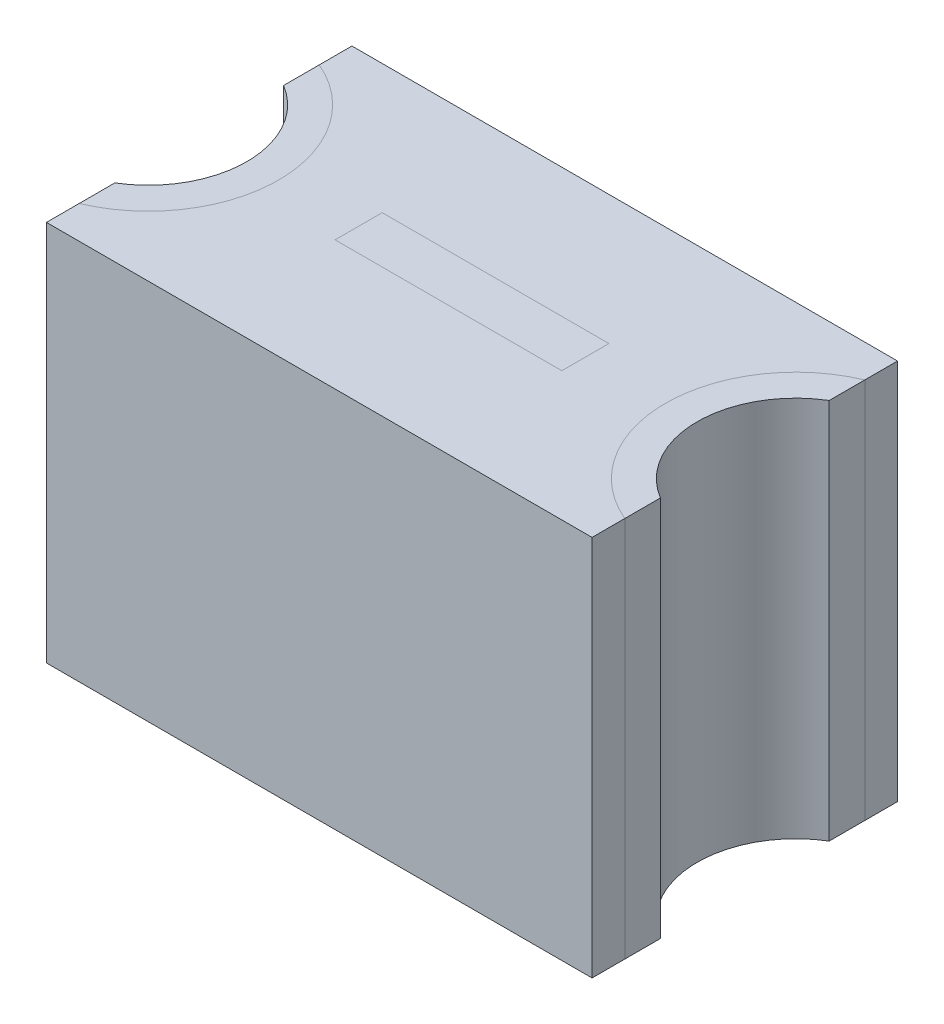
ISO-10303-21;
HEADER;
FILE_DESCRIPTION(('STEP AP214'),'2;1');
FILE_NAME('part.step','',(''),(''),'','','');
FILE_SCHEMA(('AUTOMOTIVE_DESIGN { 1 0 10303 214 1 1 1 1 }'));
ENDSEC;
DATA;
#1=APPLICATION_CONTEXT('core data for automotive mechanical design processes');
#2=APPLICATION_PROTOCOL_DEFINITION('international standard','automotive_design',2000,#1);
#3=PRODUCT_CONTEXT('',#1,'mechanical');
#4=PRODUCT('Part','Part','',(#3));
#5=PRODUCT_RELATED_PRODUCT_CATEGORY('part','',(#4));
#6=PRODUCT_DEFINITION_FORMATION('','',#4);
#7=PRODUCT_DEFINITION_CONTEXT('part definition',#1,'design');
#8=PRODUCT_DEFINITION('design','',#6,#7);
#9=PRODUCT_DEFINITION_SHAPE('','',#8);
#10=(LENGTH_UNIT() NAMED_UNIT(*) SI_UNIT(.MILLI.,.METRE.));
#11=(NAMED_UNIT(*) PLANE_ANGLE_UNIT() SI_UNIT($,.RADIAN.));
#12=(NAMED_UNIT(*) SI_UNIT($,.STERADIAN.) SOLID_ANGLE_UNIT());
#13=UNCERTAINTY_MEASURE_WITH_UNIT(LENGTH_MEASURE(1.E-05),#10,'distance_accuracy_value','');
#14=(GEOMETRIC_REPRESENTATION_CONTEXT(3) GLOBAL_UNCERTAINTY_ASSIGNED_CONTEXT((#13)) GLOBAL_UNIT_ASSIGNED_CONTEXT((#10,
#11,#12)) REPRESENTATION_CONTEXT('',''));
#15=CARTESIAN_POINT('',(0.,0.,0.));
#16=DIRECTION('',(0.,0.,1.));
#17=DIRECTION('',(1.,0.,0.));
#18=AXIS2_PLACEMENT_3D('',#15,#16,#17);
#19=CARTESIAN_POINT('',(4.646577910401,-1.995148951475,-4.551674841868));
#20=DIRECTION('',(0.,1.,0.));
#21=DIRECTION('',(0.,0.,1.));
#22=AXIS2_PLACEMENT_3D('',#19,#20,#21);
#23=CYLINDRICAL_SURFACE('',#22,0.310048429498);
#24=CARTESIAN_POINT('',(4.646577910401,-1.2,-4.551674841868));
#25=DIRECTION('',(0.,1.,0.));
#26=DIRECTION('',(0.,0.,1.));
#27=AXIS2_PLACEMENT_3D('',#24,#25,#26);
#28=CIRCLE('',#27,0.310048429498);
#29=CARTESIAN_POINT('',(4.486341377005,-1.2,-4.81710709687773));
#30=VERTEX_POINT('',#29);
#31=CARTESIAN_POINT('',(4.486341377005,-1.2,-4.28624258685827));
#32=VERTEX_POINT('',#31);
#33=EDGE_CURVE('P0_E20',#30,#32,#28,.T.);
#34=ORIENTED_EDGE('',*,*,#33,.F.);
#35=DIRECTION('',(0.,1.,0.));
#36=VECTOR('',#35,1.);
#37=CARTESIAN_POINT('',(4.486341377005,-1.995148951475,-4.817107096878));
#38=LINE('',#37,#36);
#39=CARTESIAN_POINT('',(4.486341377005,0.,-4.81710709687773));
#40=VERTEX_POINT('',#39);
#41=EDGE_CURVE('P0_E64',#40,#30,#38,.F.);
#42=ORIENTED_EDGE('',*,*,#41,.F.);
#43=CARTESIAN_POINT('',(4.646577910401,0.,-4.551674841868));
#44=DIRECTION('',(0.,1.,0.));
#45=DIRECTION('',(0.,0.,1.));
#46=AXIS2_PLACEMENT_3D('',#43,#44,#45);
#47=CIRCLE('',#46,0.310048429498);
#48=CARTESIAN_POINT('',(4.486341377005,0.,-4.28624258685827));
#49=VERTEX_POINT('',#48);
#50=EDGE_CURVE('P0_E67',#49,#40,#47,.F.);
#51=ORIENTED_EDGE('',*,*,#50,.F.);
#52=DIRECTION('',(0.,1.,0.));
#53=VECTOR('',#52,1.);
#54=CARTESIAN_POINT('',(4.486341377005,-1.995148951475,-4.286242586858));
#55=LINE('',#54,#53);
#56=EDGE_CURVE('P0_E65',#32,#49,#55,.T.);
#57=ORIENTED_EDGE('',*,*,#56,.F.);
#58=EDGE_LOOP('',(#34,#42,#51,#57));
#59=FACE_BOUND('',#58,.T.);
#60=ADVANCED_FACE('P0_F17',(#59),#23,.F.);
#61=CARTESIAN_POINT('',(4.486341377005,-1.995148951475,-4.929118834931));
#62=DIRECTION('',(1.,0.,0.));
#63=DIRECTION('',(0.,0.,-1.));
#64=AXIS2_PLACEMENT_3D('',#61,#62,#63);
#65=PLANE('',#64);
#66=DIRECTION('',(0.,1.,0.));
#67=VECTOR('',#66,1.);
#68=CARTESIAN_POINT('',(4.48634137700516,-1.995148951475,-4.92911883493063));
#69=LINE('',#68,#67);
#70=CARTESIAN_POINT('',(4.48634137700508,0.,-4.92911883493059));
#71=VERTEX_POINT('',#70);
#72=CARTESIAN_POINT('',(4.48634137700508,-1.2,-4.92911883493059));
#73=VERTEX_POINT('',#72);
#74=EDGE_CURVE('P0_E75',#71,#73,#69,.F.);
#75=ORIENTED_EDGE('',*,*,#74,.F.);
#76=DIRECTION('',(0.,0.,1.));
#77=VECTOR('',#76,1.);
#78=CARTESIAN_POINT('',(4.486341377005,0.,-4.551674841868));
#79=LINE('',#78,#77);
#80=EDGE_CURVE('P0_E80',#40,#71,#79,.F.);
#81=ORIENTED_EDGE('',*,*,#80,.F.);
#82=ORIENTED_EDGE('',*,*,#41,.T.);
#83=DIRECTION('',(0.,0.,-1.));
#84=VECTOR('',#83,1.);
#85=CARTESIAN_POINT('',(4.486341377005,-1.2,0.));
#86=LINE('',#85,#84);
#87=EDGE_CURVE('P0_E63',#73,#30,#86,.F.);
#88=ORIENTED_EDGE('',*,*,#87,.F.);
#89=EDGE_LOOP('',(#75,#81,#82,#88));
#90=FACE_BOUND('',#89,.T.);
#91=ADVANCED_FACE('P0_F90',(#90),#65,.T.);
#92=CARTESIAN_POINT('',(0.,-1.2,0.));
#93=DIRECTION('',(0.,-1.,0.));
#94=DIRECTION('',(0.,0.,-1.));
#95=AXIS2_PLACEMENT_3D('',#92,#93,#94);
#96=PLANE('',#95);
#97=CARTESIAN_POINT('',(4.646577910401,-1.2,-4.551674841868));
#98=DIRECTION('',(0.,1.,0.));
#99=DIRECTION('',(0.,0.,1.));
#100=AXIS2_PLACEMENT_3D('',#97,#98,#99);
#101=CIRCLE('',#100,0.410048429498);
#102=CARTESIAN_POINT('',(4.48634137700508,-1.2,-4.17423084880541));
#103=VERTEX_POINT('',#102);
#104=EDGE_CURVE('P0_E79',#73,#103,#101,.T.);
#105=ORIENTED_EDGE('',*,*,#104,.F.);
#106=ORIENTED_EDGE('',*,*,#87,.T.);
#107=ORIENTED_EDGE('',*,*,#33,.T.);
#108=DIRECTION('',(0.,0.,-1.));
#109=VECTOR('',#108,1.);
#110=CARTESIAN_POINT('',(4.486341377005,-1.2,-4.286242586858));
#111=LINE('',#110,#109);
#112=EDGE_CURVE('P0_E62',#103,#32,#111,.T.);
#113=ORIENTED_EDGE('',*,*,#112,.F.);
#114=EDGE_LOOP('',(#105,#106,#107,#113));
#115=FACE_BOUND('',#114,.T.);
#116=ADVANCED_FACE('P0_F60',(#115),#96,.T.);
#117=CARTESIAN_POINT('',(4.486341377005,-1.995148951475,-4.286242586858));
#118=DIRECTION('',(1.,0.,0.));
#119=DIRECTION('',(0.,0.,-1.));
#120=AXIS2_PLACEMENT_3D('',#117,#118,#119);
#121=PLANE('',#120);
#122=ORIENTED_EDGE('',*,*,#56,.T.);
#123=DIRECTION('',(0.,0.,1.));
#124=VECTOR('',#123,1.);
#125=CARTESIAN_POINT('',(4.486341377005,0.,-4.551674841868));
#126=LINE('',#125,#124);
#127=CARTESIAN_POINT('',(4.48634137700508,0.,-4.17423084880541));
#128=VERTEX_POINT('',#127);
#129=EDGE_CURVE('P0_E35',#128,#49,#126,.F.);
#130=ORIENTED_EDGE('',*,*,#129,.F.);
#131=DIRECTION('',(0.,1.,0.));
#132=VECTOR('',#131,1.);
#133=CARTESIAN_POINT('',(4.48634137700516,-1.995148951475,-4.17423084880537));
#134=LINE('',#133,#132);
#135=EDGE_CURVE('P0_E26',#103,#128,#134,.T.);
#136=ORIENTED_EDGE('',*,*,#135,.F.);
#137=ORIENTED_EDGE('',*,*,#112,.T.);
#138=EDGE_LOOP('',(#122,#130,#136,#137));
#139=FACE_BOUND('',#138,.T.);
#140=ADVANCED_FACE('P0_F69',(#139),#121,.T.);
#141=CARTESIAN_POINT('',(4.646577910401,0.,-4.551674841868));
#142=DIRECTION('',(0.,1.,0.));
#143=DIRECTION('',(0.,0.,1.));
#144=AXIS2_PLACEMENT_3D('',#141,#142,#143);
#145=PLANE('',#144);
#146=CARTESIAN_POINT('',(4.646577910401,0.,-4.551674841868));
#147=DIRECTION('',(0.,1.,0.));
#148=DIRECTION('',(0.,0.,1.));
#149=AXIS2_PLACEMENT_3D('',#146,#147,#148);
#150=CIRCLE('',#149,0.410048429498);
#151=EDGE_CURVE('P0_E11',#128,#71,#150,.F.);
#152=ORIENTED_EDGE('',*,*,#151,.F.);
#153=ORIENTED_EDGE('',*,*,#129,.T.);
#154=ORIENTED_EDGE('',*,*,#50,.T.);
#155=ORIENTED_EDGE('',*,*,#80,.T.);
#156=EDGE_LOOP('',(#152,#153,#154,#155));
#157=FACE_BOUND('',#156,.T.);
#158=ADVANCED_FACE('P0_F99',(#157),#145,.T.);
#159=CARTESIAN_POINT('',(4.646577910401,-1.995148951475,-4.551674841868));
#160=DIRECTION('',(0.,1.,0.));
#161=DIRECTION('',(0.,0.,1.));
#162=AXIS2_PLACEMENT_3D('',#159,#160,#161);
#163=CYLINDRICAL_SURFACE('',#162,0.410048429498);
#164=ORIENTED_EDGE('',*,*,#135,.T.);
#165=ORIENTED_EDGE('',*,*,#151,.T.);
#166=ORIENTED_EDGE('',*,*,#74,.T.);
#167=ORIENTED_EDGE('',*,*,#104,.T.);
#168=EDGE_LOOP('',(#164,#165,#166,#167));
#169=FACE_BOUND('',#168,.T.);
#170=ADVANCED_FACE('P0_F87',(#169),#163,.T.);
#171=CLOSED_SHELL('',(#60,#91,#116,#140,#158,#170));
#172=MANIFOLD_SOLID_BREP('P0_B1',#171);
#173=CARTESIAN_POINT('',(3.984916204577,-1.928180578813,-4.625703519728));
#174=DIRECTION('',(0.,0.,-1.));
#175=DIRECTION('',(-1.,0.,0.));
#176=AXIS2_PLACEMENT_3D('',#173,#174,#175);
#177=PLANE('',#176);
#178=DIRECTION('',(0.,1.,0.));
#179=VECTOR('',#178,1.);
#180=CARTESIAN_POINT('',(3.27194637718,-1.928180578813,-4.625703519728));
#181=LINE('',#180,#179);
#182=CARTESIAN_POINT('',(3.27194637718,0.,-4.625703519728));
#183=VERTEX_POINT('',#182);
#184=CARTESIAN_POINT('',(3.27194637718,-1.2,-4.625703519728));
#185=VERTEX_POINT('',#184);
#186=EDGE_CURVE('P1_E20',#183,#185,#181,.F.);
#187=ORIENTED_EDGE('',*,*,#186,.F.);
#188=DIRECTION('',(1.,0.,0.));
#189=VECTOR('',#188,1.);
#190=CARTESIAN_POINT('',(0.,0.,-4.625703519728));
#191=LINE('',#190,#189);
#192=CARTESIAN_POINT('',(3.984916204577,0.,-4.625703519728));
#193=VERTEX_POINT('',#192);
#194=EDGE_CURVE('P1_E81',#193,#183,#191,.F.);
#195=ORIENTED_EDGE('',*,*,#194,.F.);
#196=DIRECTION('',(0.,1.,0.));
#197=VECTOR('',#196,1.);
#198=CARTESIAN_POINT('',(3.984916204577,-1.928180578813,-4.625703519728));
#199=LINE('',#198,#197);
#200=CARTESIAN_POINT('',(3.984916204577,-1.2,-4.625703519728));
#201=VERTEX_POINT('',#200);
#202=EDGE_CURVE('P1_E68',#201,#193,#199,.T.);
#203=ORIENTED_EDGE('',*,*,#202,.F.);
#204=DIRECTION('',(1.,0.,0.));
#205=VECTOR('',#204,1.);
#206=CARTESIAN_POINT('',(0.,-1.2,-4.625703519728));
#207=LINE('',#206,#205);
#208=EDGE_CURVE('P1_E55',#185,#201,#207,.T.);
#209=ORIENTED_EDGE('',*,*,#208,.F.);
#210=EDGE_LOOP('',(#187,#195,#203,#209));
#211=FACE_BOUND('',#210,.T.);
#212=ADVANCED_FACE('P1_F17',(#211),#177,.T.);
#213=CARTESIAN_POINT('',(3.27194637718,-1.928180578813,-4.477646164007));
#214=DIRECTION('',(-1.,0.,0.));
#215=DIRECTION('',(0.,0.,1.));
#216=AXIS2_PLACEMENT_3D('',#213,#214,#215);
#217=PLANE('',#216);
#218=DIRECTION('',(0.,1.,0.));
#219=VECTOR('',#218,1.);
#220=CARTESIAN_POINT('',(3.27194637718,-1.928180578813,-4.477646164007));
#221=LINE('',#220,#219);
#222=CARTESIAN_POINT('',(3.27194637718,0.,-4.477646164007));
#223=VERTEX_POINT('',#222);
#224=CARTESIAN_POINT('',(3.27194637718,-1.2,-4.477646164007));
#225=VERTEX_POINT('',#224);
#226=EDGE_CURVE('P1_E83',#223,#225,#221,.F.);
#227=ORIENTED_EDGE('',*,*,#226,.F.);
#228=DIRECTION('',(0.,0.,1.));
#229=VECTOR('',#228,1.);
#230=CARTESIAN_POINT('',(3.27194637718,0.,0.));
#231=LINE('',#230,#229);
#232=EDGE_CURVE('P1_E64',#183,#223,#231,.T.);
#233=ORIENTED_EDGE('',*,*,#232,.F.);
#234=ORIENTED_EDGE('',*,*,#186,.T.);
#235=DIRECTION('',(0.,0.,-1.));
#236=VECTOR('',#235,1.);
#237=CARTESIAN_POINT('',(3.27194637718,-1.2,0.));
#238=LINE('',#237,#236);
#239=EDGE_CURVE('P1_E61',#225,#185,#238,.T.);
#240=ORIENTED_EDGE('',*,*,#239,.F.);
#241=EDGE_LOOP('',(#227,#233,#234,#240));
#242=FACE_BOUND('',#241,.T.);
#243=ADVANCED_FACE('P1_F60',(#242),#217,.T.);
#244=CARTESIAN_POINT('',(0.,-1.2,0.));
#245=DIRECTION('',(0.,-1.,0.));
#246=DIRECTION('',(0.,0.,-1.));
#247=AXIS2_PLACEMENT_3D('',#244,#245,#246);
#248=PLANE('',#247);
#249=DIRECTION('',(0.,0.,-1.));
#250=VECTOR('',#249,1.);
#251=CARTESIAN_POINT('',(3.984916204577,-1.2,-4.477646164007));
#252=LINE('',#251,#250);
#253=CARTESIAN_POINT('',(3.984916204577,-1.2,-4.477646164007));
#254=VERTEX_POINT('',#253);
#255=EDGE_CURVE('P1_E70',#254,#201,#252,.T.);
#256=ORIENTED_EDGE('',*,*,#255,.F.);
#257=DIRECTION('',(1.,0.,0.));
#258=VECTOR('',#257,1.);
#259=CARTESIAN_POINT('',(3.984916204577,-1.2,-4.477646164007));
#260=LINE('',#259,#258);
#261=EDGE_CURVE('P1_E74',#225,#254,#260,.T.);
#262=ORIENTED_EDGE('',*,*,#261,.F.);
#263=ORIENTED_EDGE('',*,*,#239,.T.);
#264=ORIENTED_EDGE('',*,*,#208,.T.);
#265=EDGE_LOOP('',(#256,#262,#263,#264));
#266=FACE_BOUND('',#265,.T.);
#267=ADVANCED_FACE('P1_F72',(#266),#248,.T.);
#268=CARTESIAN_POINT('',(3.984916204577,-1.928180578813,-4.477646164007));
#269=DIRECTION('',(1.,0.,0.));
#270=DIRECTION('',(0.,0.,-1.));
#271=AXIS2_PLACEMENT_3D('',#268,#269,#270);
#272=PLANE('',#271);
#273=ORIENTED_EDGE('',*,*,#202,.T.);
#274=DIRECTION('',(0.,0.,1.));
#275=VECTOR('',#274,1.);
#276=CARTESIAN_POINT('',(3.984916204577,0.,0.));
#277=LINE('',#276,#275);
#278=CARTESIAN_POINT('',(3.984916204577,0.,-4.477646164007));
#279=VERTEX_POINT('',#278);
#280=EDGE_CURVE('P1_E35',#279,#193,#277,.F.);
#281=ORIENTED_EDGE('',*,*,#280,.F.);
#282=DIRECTION('',(0.,1.,0.));
#283=VECTOR('',#282,1.);
#284=CARTESIAN_POINT('',(3.984916204577,-1.928180578813,-4.477646164007));
#285=LINE('',#284,#283);
#286=EDGE_CURVE('P1_E26',#254,#279,#285,.T.);
#287=ORIENTED_EDGE('',*,*,#286,.F.);
#288=ORIENTED_EDGE('',*,*,#255,.T.);
#289=EDGE_LOOP('',(#273,#281,#287,#288));
#290=FACE_BOUND('',#289,.T.);
#291=ADVANCED_FACE('P1_F89',(#290),#272,.T.);
#292=CARTESIAN_POINT('',(0.,0.,0.));
#293=DIRECTION('',(0.,1.,0.));
#294=DIRECTION('',(0.,0.,1.));
#295=AXIS2_PLACEMENT_3D('',#292,#293,#294);
#296=PLANE('',#295);
#297=ORIENTED_EDGE('',*,*,#280,.T.);
#298=ORIENTED_EDGE('',*,*,#194,.T.);
#299=ORIENTED_EDGE('',*,*,#232,.T.);
#300=DIRECTION('',(1.,0.,0.));
#301=VECTOR('',#300,1.);
#302=CARTESIAN_POINT('',(3.984916204577,0.,-4.477646164007));
#303=LINE('',#302,#301);
#304=EDGE_CURVE('P1_E11',#279,#223,#303,.F.);
#305=ORIENTED_EDGE('',*,*,#304,.F.);
#306=EDGE_LOOP('',(#297,#298,#299,#305));
#307=FACE_BOUND('',#306,.T.);
#308=ADVANCED_FACE('P1_F91',(#307),#296,.T.);
#309=CARTESIAN_POINT('',(3.984916204577,-1.928180578813,-4.477646164007));
#310=DIRECTION('',(0.,0.,1.));
#311=DIRECTION('',(1.,0.,0.));
#312=AXIS2_PLACEMENT_3D('',#309,#310,#311);
#313=PLANE('',#312);
#314=ORIENTED_EDGE('',*,*,#286,.T.);
#315=ORIENTED_EDGE('',*,*,#304,.T.);
#316=ORIENTED_EDGE('',*,*,#226,.T.);
#317=ORIENTED_EDGE('',*,*,#261,.T.);
#318=EDGE_LOOP('',(#314,#315,#316,#317));
#319=FACE_BOUND('',#318,.T.);
#320=ADVANCED_FACE('P1_F88',(#319),#313,.T.);
#321=CLOSED_SHELL('',(#212,#243,#267,#291,#308,#320));
#322=MANIFOLD_SOLID_BREP('P1_B1',#321);
#323=CARTESIAN_POINT('',(3.984916204577,-1.928180578813,-4.625703519728));
#324=DIRECTION('',(0.,0.,-1.));
#325=DIRECTION('',(-1.,0.,0.));
#326=AXIS2_PLACEMENT_3D('',#323,#324,#325);
#327=PLANE('',#326);
#328=DIRECTION('',(1.,0.,0.));
#329=VECTOR('',#328,1.);
#330=CARTESIAN_POINT('',(0.,0.,-4.625703519728));
#331=LINE('',#330,#329);
#332=CARTESIAN_POINT('',(3.984916204577,0.,-4.625703519728));
#333=VERTEX_POINT('',#332);
#334=CARTESIAN_POINT('',(3.27194637718,0.,-4.625703519728));
#335=VERTEX_POINT('',#334);
#336=EDGE_CURVE('P2_E167',#333,#335,#331,.F.);
#337=ORIENTED_EDGE('',*,*,#336,.T.);
#338=DIRECTION('',(0.,1.,0.));
#339=VECTOR('',#338,1.);
#340=CARTESIAN_POINT('',(3.27194637718,-1.928180578813,-4.625703519728));
#341=LINE('',#340,#339);
#342=CARTESIAN_POINT('',(3.27194637718,-1.2,-4.625703519728));
#343=VERTEX_POINT('',#342);
#344=EDGE_CURVE('P2_E176',#335,#343,#341,.F.);
#345=ORIENTED_EDGE('',*,*,#344,.T.);
#346=DIRECTION('',(1.,0.,0.));
#347=VECTOR('',#346,1.);
#348=CARTESIAN_POINT('',(0.,-1.2,-4.625703519728));
#349=LINE('',#348,#347);
#350=CARTESIAN_POINT('',(3.984916204577,-1.2,-4.625703519728));
#351=VERTEX_POINT('',#350);
#352=EDGE_CURVE('P2_E92',#351,#343,#349,.F.);
#353=ORIENTED_EDGE('',*,*,#352,.F.);
#354=DIRECTION('',(0.,1.,0.));
#355=VECTOR('',#354,1.);
#356=CARTESIAN_POINT('',(3.984916204577,-1.928180578813,-4.625703519728));
#357=LINE('',#356,#355);
#358=EDGE_CURVE('P2_E126',#351,#333,#357,.T.);
#359=ORIENTED_EDGE('',*,*,#358,.T.);
#360=EDGE_LOOP('',(#337,#345,#353,#359));
#361=FACE_BOUND('',#360,.T.);
#362=ADVANCED_FACE('P2_F17',(#361),#327,.F.);
#363=CARTESIAN_POINT('',(3.27194637718,-1.928180578813,-4.477646164007));
#364=DIRECTION('',(-1.,0.,0.));
#365=DIRECTION('',(0.,0.,1.));
#366=AXIS2_PLACEMENT_3D('',#363,#364,#365);
#367=PLANE('',#366);
#368=DIRECTION('',(0.,0.,-1.));
#369=VECTOR('',#368,1.);
#370=CARTESIAN_POINT('',(3.27194637718,0.,0.));
#371=LINE('',#370,#369);
#372=CARTESIAN_POINT('',(3.27194637718,0.,-4.477646164007));
#373=VERTEX_POINT('',#372);
#374=EDGE_CURVE('P2_E214',#335,#373,#371,.F.);
#375=ORIENTED_EDGE('',*,*,#374,.T.);
#376=DIRECTION('',(0.,1.,0.));
#377=VECTOR('',#376,1.);
#378=CARTESIAN_POINT('',(3.27194637718,-1.928180578813,-4.477646164007));
#379=LINE('',#378,#377);
#380=CARTESIAN_POINT('',(3.27194637718,-1.2,-4.477646164007));
#381=VERTEX_POINT('',#380);
#382=EDGE_CURVE('P2_E174',#373,#381,#379,.F.);
#383=ORIENTED_EDGE('',*,*,#382,.T.);
#384=DIRECTION('',(0.,0.,-1.));
#385=VECTOR('',#384,1.);
#386=CARTESIAN_POINT('',(3.27194637718,-1.2,0.));
#387=LINE('',#386,#385);
#388=EDGE_CURVE('P2_E111',#343,#381,#387,.F.);
#389=ORIENTED_EDGE('',*,*,#388,.F.);
#390=ORIENTED_EDGE('',*,*,#344,.F.);
#391=EDGE_LOOP('',(#375,#383,#389,#390));
#392=FACE_BOUND('',#391,.T.);
#393=ADVANCED_FACE('P2_F349',(#392),#367,.F.);
#394=CARTESIAN_POINT('',(3.984916204577,-1.928180578813,-4.477646164007));
#395=DIRECTION('',(0.,0.,1.));
#396=DIRECTION('',(1.,0.,0.));
#397=AXIS2_PLACEMENT_3D('',#394,#395,#396);
#398=PLANE('',#397);
#399=DIRECTION('',(1.,0.,0.));
#400=VECTOR('',#399,1.);
#401=CARTESIAN_POINT('',(0.,0.,-4.477646164007));
#402=LINE('',#401,#400);
#403=CARTESIAN_POINT('',(3.984916204577,0.,-4.477646164007));
#404=VERTEX_POINT('',#403);
#405=EDGE_CURVE('P2_E121',#373,#404,#402,.T.);
#406=ORIENTED_EDGE('',*,*,#405,.T.);
#407=DIRECTION('',(0.,1.,0.));
#408=VECTOR('',#407,1.);
#409=CARTESIAN_POINT('',(3.984916204577,-1.928180578813,-4.477646164007));
#410=LINE('',#409,#408);
#411=CARTESIAN_POINT('',(3.984916204577,-1.2,-4.477646164007));
#412=VERTEX_POINT('',#411);
#413=EDGE_CURVE('P2_E118',#404,#412,#410,.F.);
#414=ORIENTED_EDGE('',*,*,#413,.T.);
#415=DIRECTION('',(1.,0.,0.));
#416=VECTOR('',#415,1.);
#417=CARTESIAN_POINT('',(0.,-1.2,-4.477646164007));
#418=LINE('',#417,#416);
#419=EDGE_CURVE('P2_E105',#381,#412,#418,.T.);
#420=ORIENTED_EDGE('',*,*,#419,.F.);
#421=ORIENTED_EDGE('',*,*,#382,.F.);
#422=EDGE_LOOP('',(#406,#414,#420,#421));
#423=FACE_BOUND('',#422,.T.);
#424=ADVANCED_FACE('P2_F119',(#423),#398,.F.);
#425=CARTESIAN_POINT('',(3.984916204577,-1.928180578813,-4.477646164007));
#426=DIRECTION('',(1.,0.,0.));
#427=DIRECTION('',(0.,0.,-1.));
#428=AXIS2_PLACEMENT_3D('',#425,#426,#427);
#429=PLANE('',#428);
#430=DIRECTION('',(0.,0.,-1.));
#431=VECTOR('',#430,1.);
#432=CARTESIAN_POINT('',(3.984916204577,0.,0.));
#433=LINE('',#432,#431);
#434=EDGE_CURVE('P2_E218',#404,#333,#433,.T.);
#435=ORIENTED_EDGE('',*,*,#434,.T.);
#436=ORIENTED_EDGE('',*,*,#358,.F.);
#437=DIRECTION('',(0.,0.,-1.));
#438=VECTOR('',#437,1.);
#439=CARTESIAN_POINT('',(3.984916204577,-1.2,0.));
#440=LINE('',#439,#438);
#441=EDGE_CURVE('P2_E109',#412,#351,#440,.T.);
#442=ORIENTED_EDGE('',*,*,#441,.F.);
#443=ORIENTED_EDGE('',*,*,#413,.F.);
#444=EDGE_LOOP('',(#435,#436,#442,#443));
#445=FACE_BOUND('',#444,.T.);
#446=ADVANCED_FACE('P2_F128',(#445),#429,.F.);
#447=CARTESIAN_POINT('',(4.646577910401,0.,-4.551674841868));
#448=DIRECTION('',(0.,-1.,0.));
#449=DIRECTION('',(0.,0.,-1.));
#450=AXIS2_PLACEMENT_3D('',#447,#448,#449);
#451=CYLINDRICAL_SURFACE('',#450,0.410048429498);
#452=DIRECTION('',(0.,1.,0.));
#453=VECTOR('',#452,1.);
#454=CARTESIAN_POINT('',(4.486341377005,-1.2,-4.174230848805));
#455=LINE('',#454,#453);
#456=CARTESIAN_POINT('',(4.486341377005,0.,-4.17423084880522));
#457=VERTEX_POINT('',#456);
#458=CARTESIAN_POINT('',(4.486341377005,-1.2,-4.17423084880522));
#459=VERTEX_POINT('',#458);
#460=EDGE_CURVE('P2_E125',#457,#459,#455,.F.);
#461=ORIENTED_EDGE('',*,*,#460,.T.);
#462=CARTESIAN_POINT('',(4.646577910401,-1.2,-4.551674841868));
#463=DIRECTION('',(0.,-1.,0.));
#464=DIRECTION('',(0.,0.,-1.));
#465=AXIS2_PLACEMENT_3D('',#462,#463,#464);
#466=CIRCLE('',#465,0.410048429498);
#467=CARTESIAN_POINT('',(4.486341377005,-1.2,-4.92911883493078));
#468=VERTEX_POINT('',#467);
#469=EDGE_CURVE('P2_E197',#468,#459,#466,.F.);
#470=ORIENTED_EDGE('',*,*,#469,.F.);
#471=DIRECTION('',(0.,1.,0.));
#472=VECTOR('',#471,1.);
#473=CARTESIAN_POINT('',(4.486341377005,-1.2,-4.929118834931));
#474=LINE('',#473,#472);
#475=CARTESIAN_POINT('',(4.486341377005,0.,-4.92911883493078));
#476=VERTEX_POINT('',#475);
#477=EDGE_CURVE('P2_E165',#468,#476,#474,.T.);
#478=ORIENTED_EDGE('',*,*,#477,.T.);
#479=CARTESIAN_POINT('',(4.646577910401,0.,-4.551674841868));
#480=DIRECTION('',(0.,-1.,0.));
#481=DIRECTION('',(0.,0.,-1.));
#482=AXIS2_PLACEMENT_3D('',#479,#480,#481);
#483=CIRCLE('',#482,0.410048429498);
#484=EDGE_CURVE('P2_E195',#476,#457,#483,.F.);
#485=ORIENTED_EDGE('',*,*,#484,.T.);
#486=EDGE_LOOP('',(#461,#470,#478,#485));
#487=FACE_BOUND('',#486,.T.);
#488=ADVANCED_FACE('P2_F322',(#487),#451,.F.);
#489=CARTESIAN_POINT('',(4.486341377005,-1.2,-5.032015124465));
#490=DIRECTION('',(-1.,0.,0.));
#491=DIRECTION('',(0.,0.,1.));
#492=AXIS2_PLACEMENT_3D('',#489,#490,#491);
#493=PLANE('',#492);
#494=ORIENTED_EDGE('',*,*,#460,.F.);
#495=DIRECTION('',(0.,0.,-1.));
#496=VECTOR('',#495,1.);
#497=CARTESIAN_POINT('',(4.486341377005,0.,0.));
#498=LINE('',#497,#496);
#499=CARTESIAN_POINT('',(4.486341377005,0.,-4.071334559271));
#500=VERTEX_POINT('',#499);
#501=EDGE_CURVE('P2_E156',#457,#500,#498,.F.);
#502=ORIENTED_EDGE('',*,*,#501,.T.);
#503=DIRECTION('',(0.,1.,0.));
#504=VECTOR('',#503,1.);
#505=CARTESIAN_POINT('',(4.486341377005,-1.2,-4.071334559271));
#506=LINE('',#505,#504);
#507=CARTESIAN_POINT('',(4.486341377005,-1.2,-4.071334559271));
#508=VERTEX_POINT('',#507);
#509=EDGE_CURVE('P2_E149',#500,#508,#506,.F.);
#510=ORIENTED_EDGE('',*,*,#509,.T.);
#511=DIRECTION('',(0.,0.,-1.));
#512=VECTOR('',#511,1.);
#513=CARTESIAN_POINT('',(4.486341377005,-1.2,0.));
#514=LINE('',#513,#512);
#515=EDGE_CURVE('P2_E189',#459,#508,#514,.F.);
#516=ORIENTED_EDGE('',*,*,#515,.F.);
#517=EDGE_LOOP('',(#494,#502,#510,#516));
#518=FACE_BOUND('',#517,.T.);
#519=ADVANCED_FACE('P2_F312',(#518),#493,.F.);
#520=CARTESIAN_POINT('',(4.486341377005,-1.2,-4.071334559271));
#521=DIRECTION('',(0.,0.,-1.));
#522=DIRECTION('',(-1.,0.,0.));
#523=AXIS2_PLACEMENT_3D('',#520,#521,#522);
#524=PLANE('',#523);
#525=DIRECTION('',(0.,1.,0.));
#526=VECTOR('',#525,1.);
#527=CARTESIAN_POINT('',(2.770521204752,-1.2,-4.071334559271));
#528=LINE('',#527,#526);
#529=CARTESIAN_POINT('',(2.770521204752,0.,-4.071334559271));
#530=VERTEX_POINT('',#529);
#531=CARTESIAN_POINT('',(2.770521204752,-1.2,-4.071334559271));
#532=VERTEX_POINT('',#531);
#533=EDGE_CURVE('P2_E146',#530,#532,#528,.F.);
#534=ORIENTED_EDGE('',*,*,#533,.T.);
#535=DIRECTION('',(1.,0.,0.));
#536=VECTOR('',#535,1.);
#537=CARTESIAN_POINT('',(0.,-1.2,-4.071334559271));
#538=LINE('',#537,#536);
#539=EDGE_CURVE('P2_E187',#508,#532,#538,.F.);
#540=ORIENTED_EDGE('',*,*,#539,.F.);
#541=ORIENTED_EDGE('',*,*,#509,.F.);
#542=DIRECTION('',(1.,0.,0.));
#543=VECTOR('',#542,1.);
#544=CARTESIAN_POINT('',(0.,0.,-4.071334559271));
#545=LINE('',#544,#543);
#546=EDGE_CURVE('P2_E152',#500,#530,#545,.F.);
#547=ORIENTED_EDGE('',*,*,#546,.T.);
#548=EDGE_LOOP('',(#534,#540,#541,#547));
#549=FACE_BOUND('',#548,.T.);
#550=ADVANCED_FACE('P2_F303',(#549),#524,.F.);
#551=CARTESIAN_POINT('',(2.770521204752,-1.2,-5.032015124465));
#552=DIRECTION('',(1.,0.,0.));
#553=DIRECTION('',(0.,0.,-1.));
#554=AXIS2_PLACEMENT_3D('',#551,#552,#553);
#555=PLANE('',#554);
#556=DIRECTION('',(0.,-1.,0.));
#557=VECTOR('',#556,1.);
#558=CARTESIAN_POINT('',(2.77052120475184,0.,-4.17423084880537));
#559=LINE('',#558,#557);
#560=CARTESIAN_POINT('',(2.77052120475192,0.,-4.17423084880541));
#561=VERTEX_POINT('',#560);
#562=CARTESIAN_POINT('',(2.77052120475192,-1.2,-4.17423084880541));
#563=VERTEX_POINT('',#562);
#564=EDGE_CURVE('P2_E82',#561,#563,#559,.T.);
#565=ORIENTED_EDGE('',*,*,#564,.T.);
#566=DIRECTION('',(0.,0.,-1.));
#567=VECTOR('',#566,1.);
#568=CARTESIAN_POINT('',(2.770521204752,-1.2,0.));
#569=LINE('',#568,#567);
#570=EDGE_CURVE('P2_E180',#532,#563,#569,.T.);
#571=ORIENTED_EDGE('',*,*,#570,.F.);
#572=ORIENTED_EDGE('',*,*,#533,.F.);
#573=DIRECTION('',(0.,0.,-1.));
#574=VECTOR('',#573,1.);
#575=CARTESIAN_POINT('',(2.770521204752,0.,0.));
#576=LINE('',#575,#574);
#577=EDGE_CURVE('P2_E155',#530,#561,#576,.T.);
#578=ORIENTED_EDGE('',*,*,#577,.T.);
#579=EDGE_LOOP('',(#565,#571,#572,#578));
#580=FACE_BOUND('',#579,.T.);
#581=ADVANCED_FACE('P2_F293',(#580),#555,.F.);
#582=CARTESIAN_POINT('',(2.610284671356,0.,-4.551674841868));
#583=DIRECTION('',(0.,-1.,0.));
#584=DIRECTION('',(0.,0.,-1.));
#585=AXIS2_PLACEMENT_3D('',#582,#583,#584);
#586=CYLINDRICAL_SURFACE('',#585,0.410048429498);
#587=DIRECTION('',(0.,1.,0.));
#588=VECTOR('',#587,1.);
#589=CARTESIAN_POINT('',(2.770521204752,-1.2,-4.929118834931));
#590=LINE('',#589,#588);
#591=CARTESIAN_POINT('',(2.770521204752,0.,-4.92911883493078));
#592=VERTEX_POINT('',#591);
#593=CARTESIAN_POINT('',(2.770521204752,-1.2,-4.92911883493078));
#594=VERTEX_POINT('',#593);
#595=EDGE_CURVE('P2_E114',#592,#594,#590,.F.);
#596=ORIENTED_EDGE('',*,*,#595,.T.);
#597=CARTESIAN_POINT('',(2.610284671356,-1.2,-4.551674841868));
#598=DIRECTION('',(0.,-1.,0.));
#599=DIRECTION('',(0.,0.,-1.));
#600=AXIS2_PLACEMENT_3D('',#597,#598,#599);
#601=CIRCLE('',#600,0.410048429498);
#602=EDGE_CURVE('P2_E20',#563,#594,#601,.F.);
#603=ORIENTED_EDGE('',*,*,#602,.F.);
#604=ORIENTED_EDGE('',*,*,#564,.F.);
#605=CARTESIAN_POINT('',(2.610284671356,0.,-4.551674841868));
#606=DIRECTION('',(0.,-1.,0.));
#607=DIRECTION('',(0.,0.,-1.));
#608=AXIS2_PLACEMENT_3D('',#605,#606,#607);
#609=CIRCLE('',#608,0.410048429498);
#610=EDGE_CURVE('P2_E192',#561,#592,#609,.F.);
#611=ORIENTED_EDGE('',*,*,#610,.T.);
#612=EDGE_LOOP('',(#596,#603,#604,#611));
#613=FACE_BOUND('',#612,.T.);
#614=ADVANCED_FACE('P2_F255',(#613),#586,.F.);
#615=CARTESIAN_POINT('',(2.770521204752,-1.2,-5.032015124465));
#616=DIRECTION('',(1.,0.,0.));
#617=DIRECTION('',(0.,0.,-1.));
#618=AXIS2_PLACEMENT_3D('',#615,#616,#617);
#619=PLANE('',#618);
#620=ORIENTED_EDGE('',*,*,#595,.F.);
#621=DIRECTION('',(0.,0.,-1.));
#622=VECTOR('',#621,1.);
#623=CARTESIAN_POINT('',(2.770521204752,0.,0.));
#624=LINE('',#623,#622);
#625=CARTESIAN_POINT('',(2.770521204752,0.,-5.032015124465));
#626=VERTEX_POINT('',#625);
#627=EDGE_CURVE('P2_E140',#592,#626,#624,.T.);
#628=ORIENTED_EDGE('',*,*,#627,.T.);
#629=DIRECTION('',(0.,1.,0.));
#630=VECTOR('',#629,1.);
#631=CARTESIAN_POINT('',(2.770521204752,-1.2,-5.032015124465));
#632=LINE('',#631,#630);
#633=CARTESIAN_POINT('',(2.770521204752,-1.2,-5.032015124465));
#634=VERTEX_POINT('',#633);
#635=EDGE_CURVE('P2_E136',#626,#634,#632,.F.);
#636=ORIENTED_EDGE('',*,*,#635,.T.);
#637=DIRECTION('',(0.,0.,-1.));
#638=VECTOR('',#637,1.);
#639=CARTESIAN_POINT('',(2.770521204752,-1.2,0.));
#640=LINE('',#639,#638);
#641=EDGE_CURVE('P2_E198',#594,#634,#640,.T.);
#642=ORIENTED_EDGE('',*,*,#641,.F.);
#643=EDGE_LOOP('',(#620,#628,#636,#642));
#644=FACE_BOUND('',#643,.T.);
#645=ADVANCED_FACE('P2_F235',(#644),#619,.F.);
#646=CARTESIAN_POINT('',(0.,-1.2,0.));
#647=DIRECTION('',(0.,-1.,0.));
#648=DIRECTION('',(0.,0.,-1.));
#649=AXIS2_PLACEMENT_3D('',#646,#647,#648);
#650=PLANE('',#649);
#651=ORIENTED_EDGE('',*,*,#539,.T.);
#652=ORIENTED_EDGE('',*,*,#570,.T.);
#653=ORIENTED_EDGE('',*,*,#602,.T.);
#654=ORIENTED_EDGE('',*,*,#641,.T.);
#655=DIRECTION('',(1.,0.,0.));
#656=VECTOR('',#655,1.);
#657=CARTESIAN_POINT('',(4.486341377005,-1.2,-5.032015124465));
#658=LINE('',#657,#656);
#659=CARTESIAN_POINT('',(4.486341377005,-1.2,-5.032015124465));
#660=VERTEX_POINT('',#659);
#661=EDGE_CURVE('P2_E139',#634,#660,#658,.T.);
#662=ORIENTED_EDGE('',*,*,#661,.T.);
#663=DIRECTION('',(0.,0.,1.));
#664=VECTOR('',#663,1.);
#665=CARTESIAN_POINT('',(4.486341377005,-1.2,-5.032015124465));
#666=LINE('',#665,#664);
#667=EDGE_CURVE('P2_E168',#660,#468,#666,.T.);
#668=ORIENTED_EDGE('',*,*,#667,.T.);
#669=ORIENTED_EDGE('',*,*,#469,.T.);
#670=ORIENTED_EDGE('',*,*,#515,.T.);
#671=EDGE_LOOP('',(#651,#652,#653,#654,#662,#668,#669,#670));
#672=FACE_BOUND('',#671,.T.);
#673=ORIENTED_EDGE('',*,*,#352,.T.);
#674=ORIENTED_EDGE('',*,*,#388,.T.);
#675=ORIENTED_EDGE('',*,*,#419,.T.);
#676=ORIENTED_EDGE('',*,*,#441,.T.);
#677=EDGE_LOOP('',(#673,#674,#675,#676));
#678=FACE_BOUND('',#677,.T.);
#679=ADVANCED_FACE('P2_F107',(#672,#678),#650,.T.);
#680=CARTESIAN_POINT('',(4.486341377005,-1.2,-5.032015124465));
#681=DIRECTION('',(-1.,0.,0.));
#682=DIRECTION('',(0.,0.,1.));
#683=AXIS2_PLACEMENT_3D('',#680,#681,#682);
#684=PLANE('',#683);
#685=ORIENTED_EDGE('',*,*,#477,.F.);
#686=ORIENTED_EDGE('',*,*,#667,.F.);
#687=DIRECTION('',(0.,1.,0.));
#688=VECTOR('',#687,1.);
#689=CARTESIAN_POINT('',(4.486341377005,-1.2,-5.032015124465));
#690=LINE('',#689,#688);
#691=CARTESIAN_POINT('',(4.486341377005,0.,-5.032015124465));
#692=VERTEX_POINT('',#691);
#693=EDGE_CURVE('P2_E26',#660,#692,#690,.T.);
#694=ORIENTED_EDGE('',*,*,#693,.T.);
#695=DIRECTION('',(0.,0.,-1.));
#696=VECTOR('',#695,1.);
#697=CARTESIAN_POINT('',(4.486341377005,0.,0.));
#698=LINE('',#697,#696);
#699=EDGE_CURVE('P2_E34',#692,#476,#698,.F.);
#700=ORIENTED_EDGE('',*,*,#699,.T.);
#701=EDGE_LOOP('',(#685,#686,#694,#700));
#702=FACE_BOUND('',#701,.T.);
#703=ADVANCED_FACE('P2_F245',(#702),#684,.F.);
#704=CARTESIAN_POINT('',(0.,0.,0.));
#705=DIRECTION('',(0.,-1.,0.));
#706=DIRECTION('',(0.,0.,-1.));
#707=AXIS2_PLACEMENT_3D('',#704,#705,#706);
#708=PLANE('',#707);
#709=ORIENTED_EDGE('',*,*,#610,.F.);
#710=ORIENTED_EDGE('',*,*,#577,.F.);
#711=ORIENTED_EDGE('',*,*,#546,.F.);
#712=ORIENTED_EDGE('',*,*,#501,.F.);
#713=ORIENTED_EDGE('',*,*,#484,.F.);
#714=ORIENTED_EDGE('',*,*,#699,.F.);
#715=DIRECTION('',(1.,0.,0.));
#716=VECTOR('',#715,1.);
#717=CARTESIAN_POINT('',(4.486341377005,0.,-5.032015124465));
#718=LINE('',#717,#716);
#719=EDGE_CURVE('P2_E11',#692,#626,#718,.F.);
#720=ORIENTED_EDGE('',*,*,#719,.T.);
#721=ORIENTED_EDGE('',*,*,#627,.F.);
#722=EDGE_LOOP('',(#709,#710,#711,#712,#713,#714,#720,#721));
#723=FACE_BOUND('',#722,.T.);
#724=ORIENTED_EDGE('',*,*,#405,.F.);
#725=ORIENTED_EDGE('',*,*,#374,.F.);
#726=ORIENTED_EDGE('',*,*,#336,.F.);
#727=ORIENTED_EDGE('',*,*,#434,.F.);
#728=EDGE_LOOP('',(#724,#725,#726,#727));
#729=FACE_BOUND('',#728,.T.);
#730=ADVANCED_FACE('P2_F238',(#723,#729),#708,.F.);
#731=CARTESIAN_POINT('',(4.486341377005,-1.2,-5.032015124465));
#732=DIRECTION('',(0.,0.,1.));
#733=DIRECTION('',(1.,0.,0.));
#734=AXIS2_PLACEMENT_3D('',#731,#732,#733);
#735=PLANE('',#734);
#736=ORIENTED_EDGE('',*,*,#693,.F.);
#737=ORIENTED_EDGE('',*,*,#661,.F.);
#738=ORIENTED_EDGE('',*,*,#635,.F.);
#739=ORIENTED_EDGE('',*,*,#719,.F.);
#740=EDGE_LOOP('',(#736,#737,#738,#739));
#741=FACE_BOUND('',#740,.T.);
#742=ADVANCED_FACE('P2_F242',(#741),#735,.F.);
#743=CLOSED_SHELL('',(#362,#393,#424,#446,#488,#519,#550,#581,#614,#645,#679,#703,#730,#742));
#744=MANIFOLD_SOLID_BREP('P2_B1',#743);
#745=CARTESIAN_POINT('',(2.610284671356,-1.995148951475,-4.551674841868));
#746=DIRECTION('',(0.,1.,0.));
#747=DIRECTION('',(0.,0.,1.));
#748=AXIS2_PLACEMENT_3D('',#745,#746,#747);
#749=CYLINDRICAL_SURFACE('',#748,0.310048429498);
#750=CARTESIAN_POINT('',(2.610284671356,-1.2,-4.551674841868));
#751=DIRECTION('',(0.,1.,0.));
#752=DIRECTION('',(0.,0.,1.));
#753=AXIS2_PLACEMENT_3D('',#750,#751,#752);
#754=CIRCLE('',#753,0.310048429498);
#755=CARTESIAN_POINT('',(2.770521204752,-1.2,-4.28624258685827));
#756=VERTEX_POINT('',#755);
#757=CARTESIAN_POINT('',(2.770521204752,-1.2,-4.81710709687773));
#758=VERTEX_POINT('',#757);
#759=EDGE_CURVE('P3_E20',#756,#758,#754,.T.);
#760=ORIENTED_EDGE('',*,*,#759,.F.);
#761=DIRECTION('',(0.,1.,0.));
#762=VECTOR('',#761,1.);
#763=CARTESIAN_POINT('',(2.770521204752,-1.995148951475,-4.286242586858));
#764=LINE('',#763,#762);
#765=CARTESIAN_POINT('',(2.770521204752,0.,-4.28624258685827));
#766=VERTEX_POINT('',#765);
#767=EDGE_CURVE('P3_E55',#766,#756,#764,.F.);
#768=ORIENTED_EDGE('',*,*,#767,.F.);
#769=CARTESIAN_POINT('',(2.610284671356,0.,-4.551674841868));
#770=DIRECTION('',(0.,1.,0.));
#771=DIRECTION('',(0.,0.,1.));
#772=AXIS2_PLACEMENT_3D('',#769,#770,#771);
#773=CIRCLE('',#772,0.310048429498);
#774=CARTESIAN_POINT('',(2.770521204752,0.,-4.81710709687773));
#775=VERTEX_POINT('',#774);
#776=EDGE_CURVE('P3_E69',#766,#775,#773,.T.);
#777=ORIENTED_EDGE('',*,*,#776,.T.);
#778=DIRECTION('',(0.,1.,0.));
#779=VECTOR('',#778,1.);
#780=CARTESIAN_POINT('',(2.770521204752,-1.995148951475,-4.817107096878));
#781=LINE('',#780,#779);
#782=EDGE_CURVE('P3_E67',#758,#775,#781,.T.);
#783=ORIENTED_EDGE('',*,*,#782,.F.);
#784=EDGE_LOOP('',(#760,#768,#777,#783));
#785=FACE_BOUND('',#784,.T.);
#786=ADVANCED_FACE('P3_F17',(#785),#749,.F.);
#787=CARTESIAN_POINT('',(2.770521204752,-1.995148951475,-4.286242586858));
#788=DIRECTION('',(-1.,0.,0.));
#789=DIRECTION('',(0.,0.,1.));
#790=AXIS2_PLACEMENT_3D('',#787,#788,#789);
#791=PLANE('',#790);
#792=DIRECTION('',(0.,1.,0.));
#793=VECTOR('',#792,1.);
#794=CARTESIAN_POINT('',(2.77052120475184,-1.995148951475,-4.17423084880537));
#795=LINE('',#794,#793);
#796=CARTESIAN_POINT('',(2.77052120475192,0.,-4.17423084880541));
#797=VERTEX_POINT('',#796);
#798=CARTESIAN_POINT('',(2.77052120475192,-1.2,-4.17423084880541));
#799=VERTEX_POINT('',#798);
#800=EDGE_CURVE('P3_E78',#797,#799,#795,.F.);
#801=ORIENTED_EDGE('',*,*,#800,.F.);
#802=DIRECTION('',(0.,0.,-1.));
#803=VECTOR('',#802,1.);
#804=CARTESIAN_POINT('',(2.770521204752,0.,-4.551674841868));
#805=LINE('',#804,#803);
#806=EDGE_CURVE('P3_E70',#797,#766,#805,.T.);
#807=ORIENTED_EDGE('',*,*,#806,.T.);
#808=ORIENTED_EDGE('',*,*,#767,.T.);
#809=DIRECTION('',(0.,0.,-1.));
#810=VECTOR('',#809,1.);
#811=CARTESIAN_POINT('',(2.770521204752,-1.2,0.));
#812=LINE('',#811,#810);
#813=EDGE_CURVE('P3_E65',#799,#756,#812,.T.);
#814=ORIENTED_EDGE('',*,*,#813,.F.);
#815=EDGE_LOOP('',(#801,#807,#808,#814));
#816=FACE_BOUND('',#815,.T.);
#817=ADVANCED_FACE('P3_F89',(#816),#791,.T.);
#818=CARTESIAN_POINT('',(0.,-1.2,0.));
#819=DIRECTION('',(0.,-1.,0.));
#820=DIRECTION('',(0.,0.,-1.));
#821=AXIS2_PLACEMENT_3D('',#818,#819,#820);
#822=PLANE('',#821);
#823=ORIENTED_EDGE('',*,*,#759,.T.);
#824=DIRECTION('',(0.,0.,1.));
#825=VECTOR('',#824,1.);
#826=CARTESIAN_POINT('',(2.770521204752,-1.2,-4.929118834931));
#827=LINE('',#826,#825);
#828=CARTESIAN_POINT('',(2.77052120475192,-1.2,-4.92911883493059));
#829=VERTEX_POINT('',#828);
#830=EDGE_CURVE('P3_E64',#829,#758,#827,.T.);
#831=ORIENTED_EDGE('',*,*,#830,.F.);
#832=CARTESIAN_POINT('',(2.610284671356,-1.2,-4.551674841868));
#833=DIRECTION('',(0.,1.,0.));
#834=DIRECTION('',(0.,0.,1.));
#835=AXIS2_PLACEMENT_3D('',#832,#833,#834);
#836=CIRCLE('',#835,0.410048429498);
#837=EDGE_CURVE('P3_E82',#799,#829,#836,.T.);
#838=ORIENTED_EDGE('',*,*,#837,.F.);
#839=ORIENTED_EDGE('',*,*,#813,.T.);
#840=EDGE_LOOP('',(#823,#831,#838,#839));
#841=FACE_BOUND('',#840,.T.);
#842=ADVANCED_FACE('P3_F61',(#841),#822,.T.);
#843=CARTESIAN_POINT('',(2.770521204752,-1.995148951475,-4.929118834931));
#844=DIRECTION('',(-1.,0.,0.));
#845=DIRECTION('',(0.,0.,1.));
#846=AXIS2_PLACEMENT_3D('',#843,#844,#845);
#847=PLANE('',#846);
#848=ORIENTED_EDGE('',*,*,#782,.T.);
#849=DIRECTION('',(0.,0.,-1.));
#850=VECTOR('',#849,1.);
#851=CARTESIAN_POINT('',(2.770521204752,0.,-4.551674841868));
#852=LINE('',#851,#850);
#853=CARTESIAN_POINT('',(2.77052120475192,0.,-4.92911883493059));
#854=VERTEX_POINT('',#853);
#855=EDGE_CURVE('P3_E35',#775,#854,#852,.T.);
#856=ORIENTED_EDGE('',*,*,#855,.T.);
#857=DIRECTION('',(0.,1.,0.));
#858=VECTOR('',#857,1.);
#859=CARTESIAN_POINT('',(2.77052120475184,-1.995148951475,-4.92911883493063));
#860=LINE('',#859,#858);
#861=EDGE_CURVE('P3_E26',#829,#854,#860,.T.);
#862=ORIENTED_EDGE('',*,*,#861,.F.);
#863=ORIENTED_EDGE('',*,*,#830,.T.);
#864=EDGE_LOOP('',(#848,#856,#862,#863));
#865=FACE_BOUND('',#864,.T.);
#866=ADVANCED_FACE('P3_F72',(#865),#847,.T.);
#867=CARTESIAN_POINT('',(2.610284671356,0.,-4.551674841868));
#868=DIRECTION('',(0.,-1.,0.));
#869=DIRECTION('',(0.,0.,-1.));
#870=AXIS2_PLACEMENT_3D('',#867,#868,#869);
#871=PLANE('',#870);
#872=ORIENTED_EDGE('',*,*,#855,.F.);
#873=ORIENTED_EDGE('',*,*,#776,.F.);
#874=ORIENTED_EDGE('',*,*,#806,.F.);
#875=CARTESIAN_POINT('',(2.610284671356,0.,-4.551674841868));
#876=DIRECTION('',(0.,1.,0.));
#877=DIRECTION('',(0.,0.,1.));
#878=AXIS2_PLACEMENT_3D('',#875,#876,#877);
#879=CIRCLE('',#878,0.410048429498);
#880=EDGE_CURVE('P3_E11',#854,#797,#879,.F.);
#881=ORIENTED_EDGE('',*,*,#880,.F.);
#882=EDGE_LOOP('',(#872,#873,#874,#881));
#883=FACE_BOUND('',#882,.T.);
#884=ADVANCED_FACE('P3_F91',(#883),#871,.F.);
#885=CARTESIAN_POINT('',(2.610284671356,-1.995148951475,-4.551674841868));
#886=DIRECTION('',(0.,1.,0.));
#887=DIRECTION('',(0.,0.,1.));
#888=AXIS2_PLACEMENT_3D('',#885,#886,#887);
#889=CYLINDRICAL_SURFACE('',#888,0.410048429498);
#890=ORIENTED_EDGE('',*,*,#861,.T.);
#891=ORIENTED_EDGE('',*,*,#880,.T.);
#892=ORIENTED_EDGE('',*,*,#800,.T.);
#893=ORIENTED_EDGE('',*,*,#837,.T.);
#894=EDGE_LOOP('',(#890,#891,#892,#893));
#895=FACE_BOUND('',#894,.T.);
#896=ADVANCED_FACE('P3_F87',(#895),#889,.T.);
#897=CLOSED_SHELL('',(#786,#817,#842,#866,#884,#896));
#898=MANIFOLD_SOLID_BREP('P3_B1',#897);
#899=ADVANCED_BREP_SHAPE_REPRESENTATION('',(#18,#172,#322,#744,#898),#14);
#900=SHAPE_DEFINITION_REPRESENTATION(#9,#899);
ENDSEC;
END-ISO-10303-21;
